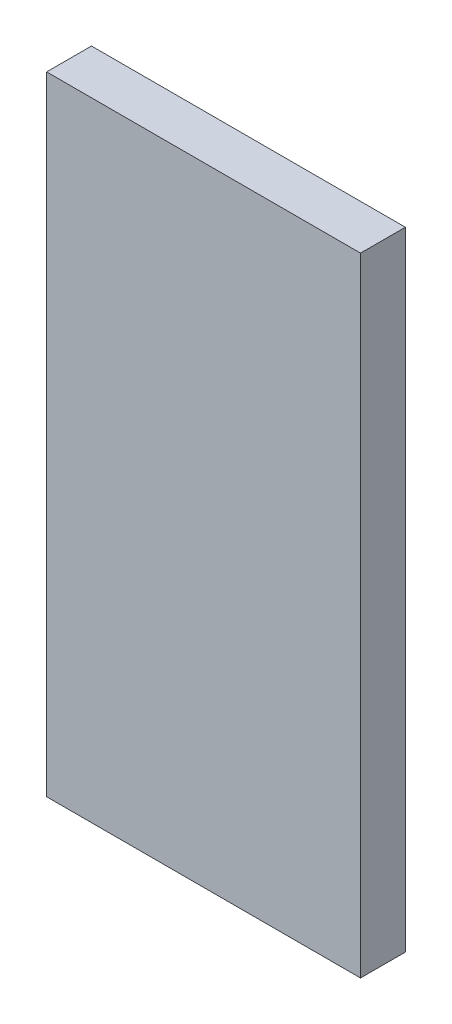
ISO-10303-21;
HEADER;
FILE_DESCRIPTION(('STEP AP214'),'2;1');
FILE_NAME('part.step','',(''),(''),'','','');
FILE_SCHEMA(('AUTOMOTIVE_DESIGN { 1 0 10303 214 1 1 1 1 }'));
ENDSEC;
DATA;
#1=APPLICATION_CONTEXT('core data for automotive mechanical design processes');
#2=APPLICATION_PROTOCOL_DEFINITION('international standard','automotive_design',2000,#1);
#3=PRODUCT_CONTEXT('',#1,'mechanical');
#4=PRODUCT('Part','Part','',(#3));
#5=PRODUCT_RELATED_PRODUCT_CATEGORY('part','',(#4));
#6=PRODUCT_DEFINITION_FORMATION('','',#4);
#7=PRODUCT_DEFINITION_CONTEXT('part definition',#1,'design');
#8=PRODUCT_DEFINITION('design','',#6,#7);
#9=PRODUCT_DEFINITION_SHAPE('','',#8);
#10=(LENGTH_UNIT() NAMED_UNIT(*) SI_UNIT(.MILLI.,.METRE.));
#11=(NAMED_UNIT(*) PLANE_ANGLE_UNIT() SI_UNIT($,.RADIAN.));
#12=(NAMED_UNIT(*) SI_UNIT($,.STERADIAN.) SOLID_ANGLE_UNIT());
#13=UNCERTAINTY_MEASURE_WITH_UNIT(LENGTH_MEASURE(1.E-05),#10,'distance_accuracy_value','');
#14=(GEOMETRIC_REPRESENTATION_CONTEXT(3) GLOBAL_UNCERTAINTY_ASSIGNED_CONTEXT((#13)) GLOBAL_UNIT_ASSIGNED_CONTEXT((#10,
#11,#12)) REPRESENTATION_CONTEXT('',''));
#15=CARTESIAN_POINT('',(0.,0.,0.));
#16=DIRECTION('',(0.,0.,1.));
#17=DIRECTION('',(1.,0.,0.));
#18=AXIS2_PLACEMENT_3D('',#15,#16,#17);
#19=CARTESIAN_POINT('',(21.,0.,6.));
#20=DIRECTION('',(-1.,0.,0.));
#21=DIRECTION('',(0.,-1.,0.));
#22=AXIS2_PLACEMENT_3D('',#19,#20,#21);
#23=PLANE('',#22);
#24=DIRECTION('',(0.,1.,0.));
#25=VECTOR('',#24,1.);
#26=CARTESIAN_POINT('',(21.,0.,0.));
#27=LINE('',#26,#25);
#28=CARTESIAN_POINT('',(21.,-21.,0.));
#29=VERTEX_POINT('',#28);
#30=CARTESIAN_POINT('',(21.,63.,0.));
#31=VERTEX_POINT('',#30);
#32=EDGE_CURVE('E108',#29,#31,#27,.T.);
#33=ORIENTED_EDGE('',*,*,#32,.T.);
#34=DIRECTION('',(0.,0.,-1.));
#35=VECTOR('',#34,1.);
#36=CARTESIAN_POINT('',(21.,63.,6.));
#37=LINE('',#36,#35);
#38=CARTESIAN_POINT('',(21.,63.,6.));
#39=VERTEX_POINT('',#38);
#40=EDGE_CURVE('E11',#39,#31,#37,.T.);
#41=ORIENTED_EDGE('',*,*,#40,.F.);
#42=DIRECTION('',(0.,1.,0.));
#43=VECTOR('',#42,1.);
#44=CARTESIAN_POINT('',(21.,0.,6.));
#45=LINE('',#44,#43);
#46=CARTESIAN_POINT('',(21.,-21.,6.));
#47=VERTEX_POINT('',#46);
#48=EDGE_CURVE('E89',#47,#39,#45,.T.);
#49=ORIENTED_EDGE('',*,*,#48,.F.);
#50=DIRECTION('',(0.,0.,-1.));
#51=VECTOR('',#50,1.);
#52=CARTESIAN_POINT('',(21.,-21.,6.));
#53=LINE('',#52,#51);
#54=EDGE_CURVE('E104',#47,#29,#53,.T.);
#55=ORIENTED_EDGE('',*,*,#54,.T.);
#56=EDGE_LOOP('',(#33,#41,#49,#55));
#57=FACE_BOUND('',#56,.T.);
#58=ADVANCED_FACE('F41',(#57),#23,.F.);
#59=CARTESIAN_POINT('',(0.,63.,6.));
#60=DIRECTION('',(0.,-1.,0.));
#61=DIRECTION('',(0.,0.,-1.));
#62=AXIS2_PLACEMENT_3D('',#59,#60,#61);
#63=PLANE('',#62);
#64=DIRECTION('',(-1.,0.,0.));
#65=VECTOR('',#64,1.);
#66=CARTESIAN_POINT('',(0.,63.,0.));
#67=LINE('',#66,#65);
#68=CARTESIAN_POINT('',(-21.,63.,0.));
#69=VERTEX_POINT('',#68);
#70=EDGE_CURVE('E95',#31,#69,#67,.T.);
#71=ORIENTED_EDGE('',*,*,#70,.T.);
#72=DIRECTION('',(0.,0.,-1.));
#73=VECTOR('',#72,1.);
#74=CARTESIAN_POINT('',(-21.,63.,6.));
#75=LINE('',#74,#73);
#76=CARTESIAN_POINT('',(-21.,63.,6.));
#77=VERTEX_POINT('',#76);
#78=EDGE_CURVE('E50',#77,#69,#75,.T.);
#79=ORIENTED_EDGE('',*,*,#78,.F.);
#80=DIRECTION('',(-1.,0.,0.));
#81=VECTOR('',#80,1.);
#82=CARTESIAN_POINT('',(0.,63.,6.));
#83=LINE('',#82,#81);
#84=EDGE_CURVE('E84',#39,#77,#83,.T.);
#85=ORIENTED_EDGE('',*,*,#84,.F.);
#86=ORIENTED_EDGE('',*,*,#40,.T.);
#87=EDGE_LOOP('',(#71,#79,#85,#86));
#88=FACE_BOUND('',#87,.T.);
#89=ADVANCED_FACE('F94',(#88),#63,.F.);
#90=CARTESIAN_POINT('',(-21.,0.,6.));
#91=DIRECTION('',(-1.,0.,0.));
#92=DIRECTION('',(0.,-1.,0.));
#93=AXIS2_PLACEMENT_3D('',#90,#91,#92);
#94=PLANE('',#93);
#95=DIRECTION('',(0.,1.,0.));
#96=VECTOR('',#95,1.);
#97=CARTESIAN_POINT('',(-21.,0.,0.));
#98=LINE('',#97,#96);
#99=CARTESIAN_POINT('',(-21.,-21.,0.));
#100=VERTEX_POINT('',#99);
#101=EDGE_CURVE('E114',#100,#69,#98,.T.);
#102=ORIENTED_EDGE('',*,*,#101,.F.);
#103=DIRECTION('',(0.,0.,-1.));
#104=VECTOR('',#103,1.);
#105=CARTESIAN_POINT('',(-21.,-21.,6.));
#106=LINE('',#105,#104);
#107=CARTESIAN_POINT('',(-21.,-21.,6.));
#108=VERTEX_POINT('',#107);
#109=EDGE_CURVE('E74',#108,#100,#106,.T.);
#110=ORIENTED_EDGE('',*,*,#109,.F.);
#111=DIRECTION('',(0.,1.,0.));
#112=VECTOR('',#111,1.);
#113=CARTESIAN_POINT('',(-21.,0.,6.));
#114=LINE('',#113,#112);
#115=EDGE_CURVE('E87',#108,#77,#114,.T.);
#116=ORIENTED_EDGE('',*,*,#115,.T.);
#117=ORIENTED_EDGE('',*,*,#78,.T.);
#118=EDGE_LOOP('',(#102,#110,#116,#117));
#119=FACE_BOUND('',#118,.T.);
#120=ADVANCED_FACE('F100',(#119),#94,.T.);
#121=CARTESIAN_POINT('',(0.,-21.,6.));
#122=DIRECTION('',(0.,1.,0.));
#123=DIRECTION('',(0.,0.,1.));
#124=AXIS2_PLACEMENT_3D('',#121,#122,#123);
#125=PLANE('',#124);
#126=DIRECTION('',(1.,0.,0.));
#127=VECTOR('',#126,1.);
#128=CARTESIAN_POINT('',(0.,-21.,0.));
#129=LINE('',#128,#127);
#130=EDGE_CURVE('E77',#100,#29,#129,.T.);
#131=ORIENTED_EDGE('',*,*,#130,.T.);
#132=ORIENTED_EDGE('',*,*,#54,.F.);
#133=DIRECTION('',(1.,0.,0.));
#134=VECTOR('',#133,1.);
#135=CARTESIAN_POINT('',(0.,-21.,6.));
#136=LINE('',#135,#134);
#137=EDGE_CURVE('E58',#108,#47,#136,.T.);
#138=ORIENTED_EDGE('',*,*,#137,.F.);
#139=ORIENTED_EDGE('',*,*,#109,.T.);
#140=EDGE_LOOP('',(#131,#132,#138,#139));
#141=FACE_BOUND('',#140,.T.);
#142=ADVANCED_FACE('F131',(#141),#125,.F.);
#143=CARTESIAN_POINT('',(0.,0.,6.));
#144=DIRECTION('',(0.,0.,1.));
#145=DIRECTION('',(1.,0.,0.));
#146=AXIS2_PLACEMENT_3D('',#143,#144,#145);
#147=PLANE('',#146);
#148=ORIENTED_EDGE('',*,*,#48,.T.);
#149=ORIENTED_EDGE('',*,*,#84,.T.);
#150=ORIENTED_EDGE('',*,*,#115,.F.);
#151=ORIENTED_EDGE('',*,*,#137,.T.);
#152=EDGE_LOOP('',(#148,#149,#150,#151));
#153=FACE_BOUND('',#152,.T.);
#154=ADVANCED_FACE('F85',(#153),#147,.T.);
#155=CARTESIAN_POINT('',(0.,0.,0.));
#156=DIRECTION('',(0.,0.,1.));
#157=DIRECTION('',(1.,0.,0.));
#158=AXIS2_PLACEMENT_3D('',#155,#156,#157);
#159=PLANE('',#158);
#160=ORIENTED_EDGE('',*,*,#32,.F.);
#161=ORIENTED_EDGE('',*,*,#130,.F.);
#162=ORIENTED_EDGE('',*,*,#101,.T.);
#163=ORIENTED_EDGE('',*,*,#70,.F.);
#164=EDGE_LOOP('',(#160,#161,#162,#163));
#165=FACE_BOUND('',#164,.T.);
#166=ADVANCED_FACE('F125',(#165),#159,.F.);
#167=CLOSED_SHELL('',(#58,#89,#120,#142,#154,#166));
#168=MANIFOLD_SOLID_BREP('B2',#167);
#169=ADVANCED_BREP_SHAPE_REPRESENTATION('',(#18,#168),#14);
#170=SHAPE_DEFINITION_REPRESENTATION(#9,#169);
ENDSEC;
END-ISO-10303-21;
